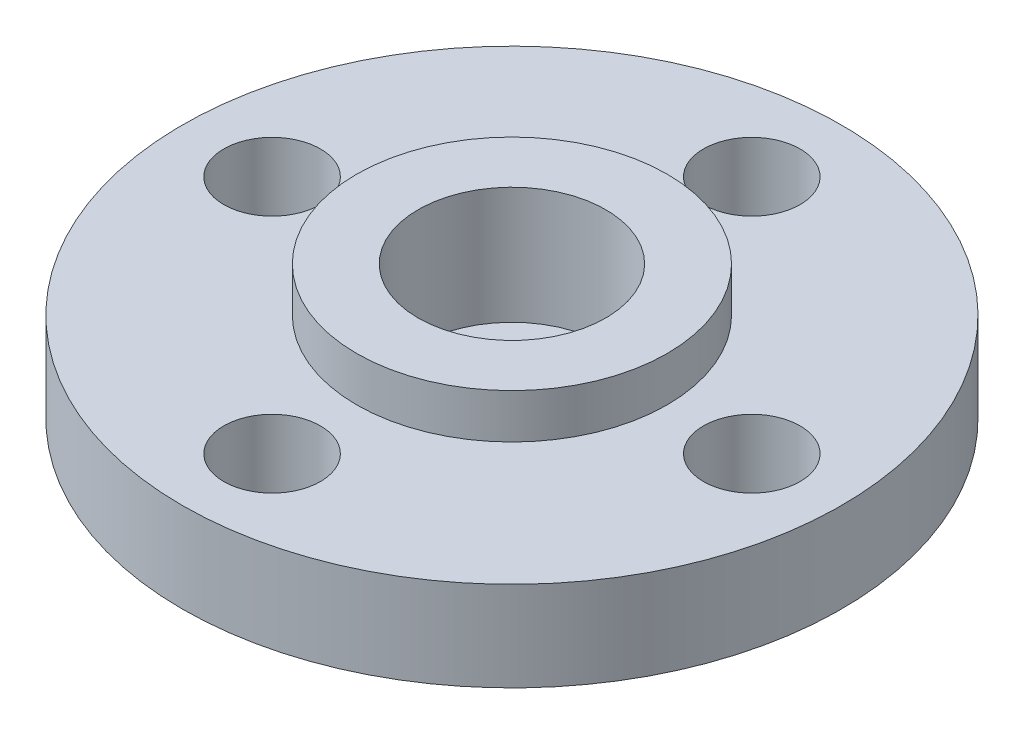
ISO-10303-21;
HEADER;
FILE_DESCRIPTION(('STEP AP214'),'2;1');
FILE_NAME('part.step','',(''),(''),'','','');
FILE_SCHEMA(('AUTOMOTIVE_DESIGN { 1 0 10303 214 1 1 1 1 }'));
ENDSEC;
DATA;
#1=APPLICATION_CONTEXT('core data for automotive mechanical design processes');
#2=APPLICATION_PROTOCOL_DEFINITION('international standard','automotive_design',2000,#1);
#3=PRODUCT_CONTEXT('',#1,'mechanical');
#4=PRODUCT('Part','Part','',(#3));
#5=PRODUCT_RELATED_PRODUCT_CATEGORY('part','',(#4));
#6=PRODUCT_DEFINITION_FORMATION('','',#4);
#7=PRODUCT_DEFINITION_CONTEXT('part definition',#1,'design');
#8=PRODUCT_DEFINITION('design','',#6,#7);
#9=PRODUCT_DEFINITION_SHAPE('','',#8);
#10=(LENGTH_UNIT() NAMED_UNIT(*) SI_UNIT(.MILLI.,.METRE.));
#11=(NAMED_UNIT(*) PLANE_ANGLE_UNIT() SI_UNIT($,.RADIAN.));
#12=(NAMED_UNIT(*) SI_UNIT($,.STERADIAN.) SOLID_ANGLE_UNIT());
#13=UNCERTAINTY_MEASURE_WITH_UNIT(LENGTH_MEASURE(1.E-05),#10,'distance_accuracy_value','');
#14=(GEOMETRIC_REPRESENTATION_CONTEXT(3) GLOBAL_UNCERTAINTY_ASSIGNED_CONTEXT((#13)) GLOBAL_UNIT_ASSIGNED_CONTEXT((#10,
#11,#12)) REPRESENTATION_CONTEXT('',''));
#15=CARTESIAN_POINT('',(0.,0.,0.));
#16=DIRECTION('',(0.,0.,1.));
#17=DIRECTION('',(1.,0.,0.));
#18=AXIS2_PLACEMENT_3D('',#15,#16,#17);
#19=CARTESIAN_POINT('',(0.,2.6,0.));
#20=DIRECTION('',(0.,-1.,0.));
#21=DIRECTION('',(0.,0.,-1.));
#22=AXIS2_PLACEMENT_3D('',#19,#20,#21);
#23=CYLINDRICAL_SURFACE('',#22,9.55);
#24=CARTESIAN_POINT('',(0.,2.6,0.));
#25=DIRECTION('',(0.,1.,0.));
#26=DIRECTION('',(0.,0.,1.));
#27=AXIS2_PLACEMENT_3D('',#24,#25,#26);
#28=CIRCLE('',#27,9.55);
#29=CARTESIAN_POINT('',(0.,2.6,9.55));
#30=VERTEX_POINT('',#29);
#31=EDGE_CURVE('E46',#30,#30,#28,.T.);
#32=ORIENTED_EDGE('',*,*,#31,.F.);
#33=EDGE_LOOP('',(#32));
#34=FACE_BOUND('',#33,.T.);
#35=CARTESIAN_POINT('',(0.,0.,0.));
#36=DIRECTION('',(0.,1.,0.));
#37=DIRECTION('',(0.,0.,1.));
#38=AXIS2_PLACEMENT_3D('',#35,#36,#37);
#39=CIRCLE('',#38,9.55);
#40=CARTESIAN_POINT('',(0.,0.,9.55));
#41=VERTEX_POINT('',#40);
#42=EDGE_CURVE('E51',#41,#41,#39,.T.);
#43=ORIENTED_EDGE('',*,*,#42,.T.);
#44=EDGE_LOOP('',(#43));
#45=FACE_BOUND('',#44,.T.);
#46=ADVANCED_FACE('F39',(#34,#45),#23,.T.);
#47=CARTESIAN_POINT('',(0.,2.6,0.));
#48=DIRECTION('',(0.,1.,0.));
#49=DIRECTION('',(0.,0.,1.));
#50=AXIS2_PLACEMENT_3D('',#47,#48,#49);
#51=PLANE('',#50);
#52=CARTESIAN_POINT('',(0.,2.6,-6.95));
#53=DIRECTION('',(0.,1.,0.));
#54=DIRECTION('',(0.,0.,1.));
#55=AXIS2_PLACEMENT_3D('',#52,#53,#54);
#56=CIRCLE('',#55,1.4);
#57=CARTESIAN_POINT('',(0.,2.6,-5.55));
#58=VERTEX_POINT('',#57);
#59=EDGE_CURVE('E71',#58,#58,#56,.T.);
#60=ORIENTED_EDGE('',*,*,#59,.F.);
#61=EDGE_LOOP('',(#60));
#62=FACE_BOUND('',#61,.T.);
#63=CARTESIAN_POINT('',(6.94999999999998,2.6,0.));
#64=DIRECTION('',(0.,1.,0.));
#65=DIRECTION('',(0.,0.,1.));
#66=AXIS2_PLACEMENT_3D('',#63,#64,#65);
#67=CIRCLE('',#66,1.4);
#68=CARTESIAN_POINT('',(6.94999999999998,2.6,1.4));
#69=VERTEX_POINT('',#68);
#70=EDGE_CURVE('E89',#69,#69,#67,.T.);
#71=ORIENTED_EDGE('',*,*,#70,.F.);
#72=EDGE_LOOP('',(#71));
#73=FACE_BOUND('',#72,.T.);
#74=CARTESIAN_POINT('',(0.,2.6,6.95));
#75=DIRECTION('',(0.,1.,0.));
#76=DIRECTION('',(0.,0.,1.));
#77=AXIS2_PLACEMENT_3D('',#74,#75,#76);
#78=CIRCLE('',#77,1.4);
#79=CARTESIAN_POINT('',(0.,2.6,8.35));
#80=VERTEX_POINT('',#79);
#81=EDGE_CURVE('E83',#80,#80,#78,.T.);
#82=ORIENTED_EDGE('',*,*,#81,.F.);
#83=EDGE_LOOP('',(#82));
#84=FACE_BOUND('',#83,.T.);
#85=CARTESIAN_POINT('',(-6.95000000000003,2.6,0.));
#86=DIRECTION('',(0.,1.,0.));
#87=DIRECTION('',(0.,0.,1.));
#88=AXIS2_PLACEMENT_3D('',#85,#86,#87);
#89=CIRCLE('',#88,1.4);
#90=CARTESIAN_POINT('',(-6.95000000000003,2.6,1.4));
#91=VERTEX_POINT('',#90);
#92=EDGE_CURVE('E77',#91,#91,#89,.T.);
#93=ORIENTED_EDGE('',*,*,#92,.F.);
#94=EDGE_LOOP('',(#93));
#95=FACE_BOUND('',#94,.T.);
#96=CARTESIAN_POINT('',(0.,2.6,0.));
#97=DIRECTION('',(0.,1.,0.));
#98=DIRECTION('',(0.,0.,1.));
#99=AXIS2_PLACEMENT_3D('',#96,#97,#98);
#100=CIRCLE('',#99,4.5);
#101=CARTESIAN_POINT('',(0.,2.6,4.5));
#102=VERTEX_POINT('',#101);
#103=EDGE_CURVE('E11',#102,#102,#100,.T.);
#104=ORIENTED_EDGE('',*,*,#103,.F.);
#105=EDGE_LOOP('',(#104));
#106=FACE_BOUND('',#105,.T.);
#107=ORIENTED_EDGE('',*,*,#31,.T.);
#108=EDGE_LOOP('',(#107));
#109=FACE_BOUND('',#108,.T.);
#110=ADVANCED_FACE('F97',(#62,#73,#84,#95,#106,#109),#51,.T.);
#111=CARTESIAN_POINT('',(0.,0.,0.));
#112=DIRECTION('',(0.,1.,0.));
#113=DIRECTION('',(0.,0.,1.));
#114=AXIS2_PLACEMENT_3D('',#111,#112,#113);
#115=PLANE('',#114);
#116=CARTESIAN_POINT('',(0.,0.,-6.95));
#117=DIRECTION('',(0.,1.,0.));
#118=DIRECTION('',(0.,0.,1.));
#119=AXIS2_PLACEMENT_3D('',#116,#117,#118);
#120=CIRCLE('',#119,1.4);
#121=CARTESIAN_POINT('',(0.,0.,-5.55));
#122=VERTEX_POINT('',#121);
#123=EDGE_CURVE('E67',#122,#122,#120,.T.);
#124=ORIENTED_EDGE('',*,*,#123,.T.);
#125=EDGE_LOOP('',(#124));
#126=FACE_BOUND('',#125,.T.);
#127=CARTESIAN_POINT('',(6.94999999999998,0.,0.));
#128=DIRECTION('',(0.,1.,0.));
#129=DIRECTION('',(0.,0.,1.));
#130=AXIS2_PLACEMENT_3D('',#127,#128,#129);
#131=CIRCLE('',#130,1.4);
#132=CARTESIAN_POINT('',(6.94999999999998,0.,1.4));
#133=VERTEX_POINT('',#132);
#134=EDGE_CURVE('E86',#133,#133,#131,.T.);
#135=ORIENTED_EDGE('',*,*,#134,.T.);
#136=EDGE_LOOP('',(#135));
#137=FACE_BOUND('',#136,.T.);
#138=CARTESIAN_POINT('',(0.,0.,6.95));
#139=DIRECTION('',(0.,1.,0.));
#140=DIRECTION('',(0.,0.,1.));
#141=AXIS2_PLACEMENT_3D('',#138,#139,#140);
#142=CIRCLE('',#141,1.4);
#143=CARTESIAN_POINT('',(0.,0.,8.35));
#144=VERTEX_POINT('',#143);
#145=EDGE_CURVE('E80',#144,#144,#142,.T.);
#146=ORIENTED_EDGE('',*,*,#145,.T.);
#147=EDGE_LOOP('',(#146));
#148=FACE_BOUND('',#147,.T.);
#149=CARTESIAN_POINT('',(-6.95000000000003,0.,0.));
#150=DIRECTION('',(0.,1.,0.));
#151=DIRECTION('',(0.,0.,1.));
#152=AXIS2_PLACEMENT_3D('',#149,#150,#151);
#153=CIRCLE('',#152,1.4);
#154=CARTESIAN_POINT('',(-6.95000000000003,0.,1.4));
#155=VERTEX_POINT('',#154);
#156=EDGE_CURVE('E74',#155,#155,#153,.T.);
#157=ORIENTED_EDGE('',*,*,#156,.T.);
#158=EDGE_LOOP('',(#157));
#159=FACE_BOUND('',#158,.T.);
#160=ORIENTED_EDGE('',*,*,#42,.F.);
#161=EDGE_LOOP('',(#160));
#162=FACE_BOUND('',#161,.T.);
#163=ADVANCED_FACE('F100',(#126,#137,#148,#159,#162),#115,.F.);
#164=CARTESIAN_POINT('',(0.,3.89,0.));
#165=DIRECTION('',(0.,-1.,0.));
#166=DIRECTION('',(0.,0.,-1.));
#167=AXIS2_PLACEMENT_3D('',#164,#165,#166);
#168=CYLINDRICAL_SURFACE('',#167,4.5);
#169=CARTESIAN_POINT('',(0.,3.89,0.));
#170=DIRECTION('',(0.,1.,0.));
#171=DIRECTION('',(0.,0.,1.));
#172=AXIS2_PLACEMENT_3D('',#169,#170,#171);
#173=CIRCLE('',#172,4.5);
#174=CARTESIAN_POINT('',(0.,3.89,4.5));
#175=VERTEX_POINT('',#174);
#176=EDGE_CURVE('E54',#175,#175,#173,.T.);
#177=ORIENTED_EDGE('',*,*,#176,.F.);
#178=EDGE_LOOP('',(#177));
#179=FACE_BOUND('',#178,.T.);
#180=ORIENTED_EDGE('',*,*,#103,.T.);
#181=EDGE_LOOP('',(#180));
#182=FACE_BOUND('',#181,.T.);
#183=ADVANCED_FACE('F119',(#179,#182),#168,.T.);
#184=CARTESIAN_POINT('',(0.,3.89,0.));
#185=DIRECTION('',(0.,1.,0.));
#186=DIRECTION('',(0.,0.,1.));
#187=AXIS2_PLACEMENT_3D('',#184,#185,#186);
#188=PLANE('',#187);
#189=CARTESIAN_POINT('',(0.,3.89,0.));
#190=DIRECTION('',(0.,1.,0.));
#191=DIRECTION('',(0.,0.,1.));
#192=AXIS2_PLACEMENT_3D('',#189,#190,#191);
#193=CIRCLE('',#192,2.72);
#194=CARTESIAN_POINT('',(0.,3.89,2.72));
#195=VERTEX_POINT('',#194);
#196=EDGE_CURVE('E42',#195,#195,#193,.T.);
#197=ORIENTED_EDGE('',*,*,#196,.F.);
#198=EDGE_LOOP('',(#197));
#199=FACE_BOUND('',#198,.T.);
#200=ORIENTED_EDGE('',*,*,#176,.T.);
#201=EDGE_LOOP('',(#200));
#202=FACE_BOUND('',#201,.T.);
#203=ADVANCED_FACE('F123',(#199,#202),#188,.T.);
#204=CARTESIAN_POINT('',(0.,-7.69332177930964,0.));
#205=DIRECTION('',(0.,1.,0.));
#206=DIRECTION('',(0.,0.,1.));
#207=AXIS2_PLACEMENT_3D('',#204,#205,#206);
#208=CYLINDRICAL_SURFACE('',#207,2.72);
#209=ORIENTED_EDGE('',*,*,#196,.T.);
#210=EDGE_LOOP('',(#209));
#211=FACE_BOUND('',#210,.T.);
#212=CARTESIAN_POINT('',(0.,0.5,0.));
#213=DIRECTION('',(0.,1.,0.));
#214=DIRECTION('',(0.,0.,1.));
#215=AXIS2_PLACEMENT_3D('',#212,#213,#214);
#216=CIRCLE('',#215,2.72);
#217=CARTESIAN_POINT('',(0.,0.5,2.72));
#218=VERTEX_POINT('',#217);
#219=EDGE_CURVE('E63',#218,#218,#216,.F.);
#220=ORIENTED_EDGE('',*,*,#219,.T.);
#221=EDGE_LOOP('',(#220));
#222=FACE_BOUND('',#221,.T.);
#223=ADVANCED_FACE('F133',(#211,#222),#208,.F.);
#224=CARTESIAN_POINT('',(0.,0.5,0.));
#225=DIRECTION('',(0.,1.,0.));
#226=DIRECTION('',(0.,0.,1.));
#227=AXIS2_PLACEMENT_3D('',#224,#225,#226);
#228=PLANE('',#227);
#229=ORIENTED_EDGE('',*,*,#219,.F.);
#230=EDGE_LOOP('',(#229));
#231=FACE_BOUND('',#230,.T.);
#232=ADVANCED_FACE('F142',(#231),#228,.T.);
#233=CARTESIAN_POINT('',(-6.95000000000003,0.,0.));
#234=DIRECTION('',(0.,1.,0.));
#235=DIRECTION('',(0.,0.,1.));
#236=AXIS2_PLACEMENT_3D('',#233,#234,#235);
#237=CYLINDRICAL_SURFACE('',#236,1.4);
#238=ORIENTED_EDGE('',*,*,#156,.F.);
#239=EDGE_LOOP('',(#238));
#240=FACE_BOUND('',#239,.T.);
#241=ORIENTED_EDGE('',*,*,#92,.T.);
#242=EDGE_LOOP('',(#241));
#243=FACE_BOUND('',#242,.T.);
#244=ADVANCED_FACE('F149',(#240,#243),#237,.F.);
#245=CARTESIAN_POINT('',(0.,0.,6.95));
#246=DIRECTION('',(0.,1.,0.));
#247=DIRECTION('',(0.,0.,1.));
#248=AXIS2_PLACEMENT_3D('',#245,#246,#247);
#249=CYLINDRICAL_SURFACE('',#248,1.4);
#250=ORIENTED_EDGE('',*,*,#145,.F.);
#251=EDGE_LOOP('',(#250));
#252=FACE_BOUND('',#251,.T.);
#253=ORIENTED_EDGE('',*,*,#81,.T.);
#254=EDGE_LOOP('',(#253));
#255=FACE_BOUND('',#254,.T.);
#256=ADVANCED_FACE('F169',(#252,#255),#249,.F.);
#257=CARTESIAN_POINT('',(6.94999999999998,0.,0.));
#258=DIRECTION('',(0.,1.,0.));
#259=DIRECTION('',(0.,0.,1.));
#260=AXIS2_PLACEMENT_3D('',#257,#258,#259);
#261=CYLINDRICAL_SURFACE('',#260,1.4);
#262=ORIENTED_EDGE('',*,*,#134,.F.);
#263=EDGE_LOOP('',(#262));
#264=FACE_BOUND('',#263,.T.);
#265=ORIENTED_EDGE('',*,*,#70,.T.);
#266=EDGE_LOOP('',(#265));
#267=FACE_BOUND('',#266,.T.);
#268=ADVANCED_FACE('F178',(#264,#267),#261,.F.);
#269=CARTESIAN_POINT('',(0.,0.,-6.95));
#270=DIRECTION('',(0.,1.,0.));
#271=DIRECTION('',(0.,0.,1.));
#272=AXIS2_PLACEMENT_3D('',#269,#270,#271);
#273=CYLINDRICAL_SURFACE('',#272,1.4);
#274=ORIENTED_EDGE('',*,*,#123,.F.);
#275=EDGE_LOOP('',(#274));
#276=FACE_BOUND('',#275,.T.);
#277=ORIENTED_EDGE('',*,*,#59,.T.);
#278=EDGE_LOOP('',(#277));
#279=FACE_BOUND('',#278,.T.);
#280=ADVANCED_FACE('F95',(#276,#279),#273,.F.);
#281=CLOSED_SHELL('',(#46,#110,#163,#183,#203,#223,#232,#244,#256,#268,#280));
#282=MANIFOLD_SOLID_BREP('B2',#281);
#283=ADVANCED_BREP_SHAPE_REPRESENTATION('',(#18,#282),#14);
#284=SHAPE_DEFINITION_REPRESENTATION(#9,#283);
ENDSEC;
END-ISO-10303-21;
